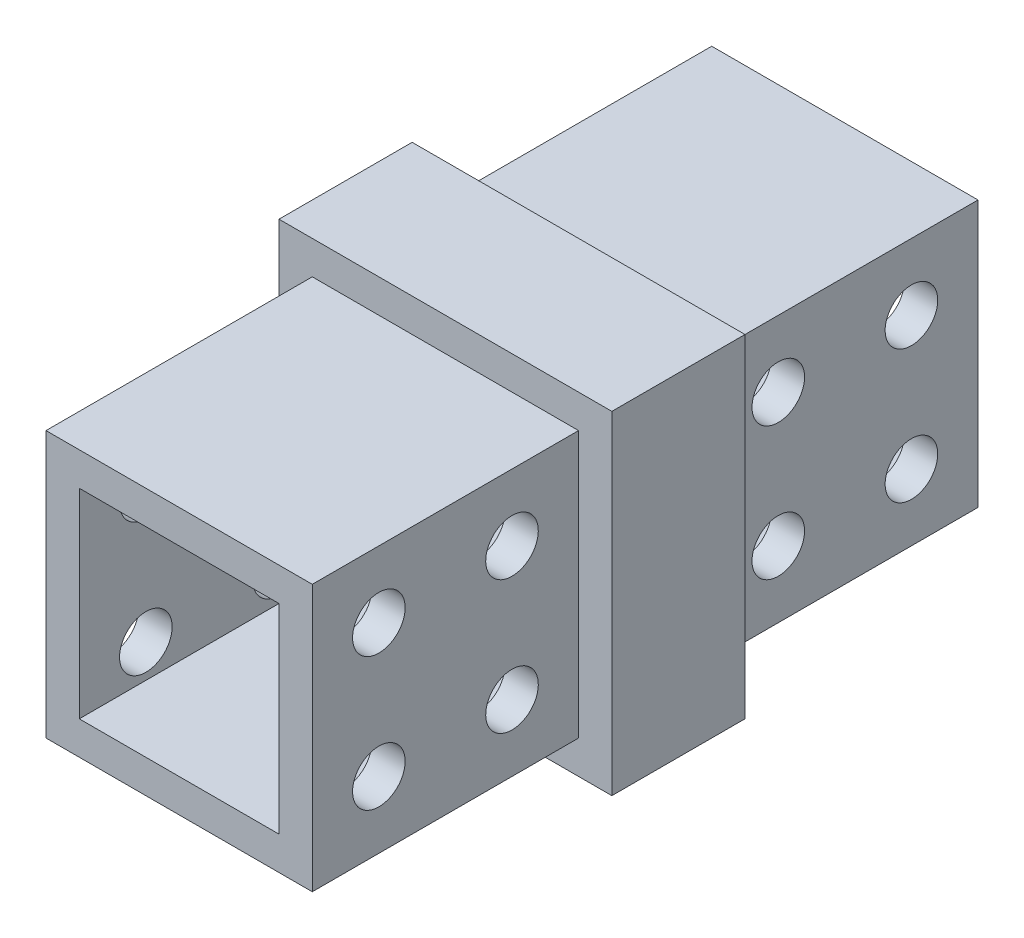
ISO-10303-21;
HEADER;
FILE_DESCRIPTION(('STEP AP214'),'2;1');
FILE_NAME('part.step','',(''),(''),'','','');
FILE_SCHEMA(('AUTOMOTIVE_DESIGN { 1 0 10303 214 1 1 1 1 }'));
ENDSEC;
DATA;
#1=APPLICATION_CONTEXT('core data for automotive mechanical design processes');
#2=APPLICATION_PROTOCOL_DEFINITION('international standard','automotive_design',2000,#1);
#3=PRODUCT_CONTEXT('',#1,'mechanical');
#4=PRODUCT('Part','Part','',(#3));
#5=PRODUCT_RELATED_PRODUCT_CATEGORY('part','',(#4));
#6=PRODUCT_DEFINITION_FORMATION('','',#4);
#7=PRODUCT_DEFINITION_CONTEXT('part definition',#1,'design');
#8=PRODUCT_DEFINITION('design','',#6,#7);
#9=PRODUCT_DEFINITION_SHAPE('','',#8);
#10=(LENGTH_UNIT() NAMED_UNIT(*) SI_UNIT(.MILLI.,.METRE.));
#11=(NAMED_UNIT(*) PLANE_ANGLE_UNIT() SI_UNIT($,.RADIAN.));
#12=(NAMED_UNIT(*) SI_UNIT($,.STERADIAN.) SOLID_ANGLE_UNIT());
#13=UNCERTAINTY_MEASURE_WITH_UNIT(LENGTH_MEASURE(1.E-05),#10,'distance_accuracy_value','');
#14=(GEOMETRIC_REPRESENTATION_CONTEXT(3) GLOBAL_UNCERTAINTY_ASSIGNED_CONTEXT((#13)) GLOBAL_UNIT_ASSIGNED_CONTEXT((#10,
#11,#12)) REPRESENTATION_CONTEXT('',''));
#15=CARTESIAN_POINT('',(0.,0.,0.));
#16=DIRECTION('',(0.,0.,1.));
#17=DIRECTION('',(1.,0.,0.));
#18=AXIS2_PLACEMENT_3D('',#15,#16,#17);
#19=CARTESIAN_POINT('',(-25.4,-6.35000000000001,57.15));
#20=DIRECTION('',(1.,0.,0.));
#21=DIRECTION('',(0.,1.,0.));
#22=AXIS2_PLACEMENT_3D('',#19,#20,#21);
#23=CYLINDRICAL_SURFACE('',#22,2.50825000000001);
#24=CARTESIAN_POINT('',(-22.225,-6.35000000000001,57.15));
#25=DIRECTION('',(-1.,0.,0.));
#26=DIRECTION('',(0.,-1.,0.));
#27=AXIS2_PLACEMENT_3D('',#24,#25,#26);
#28=CIRCLE('',#27,2.50825000000001);
#29=CARTESIAN_POINT('',(-22.225,-8.85825000000001,57.15));
#30=VERTEX_POINT('',#29);
#31=EDGE_CURVE('E205',#30,#30,#28,.F.);
#32=ORIENTED_EDGE('',*,*,#31,.T.);
#33=EDGE_LOOP('',(#32));
#34=FACE_BOUND('',#33,.T.);
#35=CARTESIAN_POINT('',(-25.4,-6.35000000000001,57.15));
#36=DIRECTION('',(1.,0.,0.));
#37=DIRECTION('',(0.,1.,0.));
#38=AXIS2_PLACEMENT_3D('',#35,#36,#37);
#39=CIRCLE('',#38,2.50825000000001);
#40=CARTESIAN_POINT('',(-25.4,-3.84175,57.15));
#41=VERTEX_POINT('',#40);
#42=EDGE_CURVE('E227',#41,#41,#39,.T.);
#43=ORIENTED_EDGE('',*,*,#42,.F.);
#44=EDGE_LOOP('',(#43));
#45=FACE_BOUND('',#44,.T.);
#46=ADVANCED_FACE('F33',(#34,#45),#23,.F.);
#47=CARTESIAN_POINT('',(-25.4,-19.05,44.45));
#48=DIRECTION('',(1.,0.,0.));
#49=DIRECTION('',(0.,1.,0.));
#50=AXIS2_PLACEMENT_3D('',#47,#48,#49);
#51=CYLINDRICAL_SURFACE('',#50,2.50825000000001);
#52=CARTESIAN_POINT('',(-22.225,-19.05,44.45));
#53=DIRECTION('',(-1.,0.,0.));
#54=DIRECTION('',(0.,-1.,0.));
#55=AXIS2_PLACEMENT_3D('',#52,#53,#54);
#56=CIRCLE('',#55,2.50825000000001);
#57=CARTESIAN_POINT('',(-22.225,-21.55825,44.45));
#58=VERTEX_POINT('',#57);
#59=EDGE_CURVE('E202',#58,#58,#56,.F.);
#60=ORIENTED_EDGE('',*,*,#59,.T.);
#61=EDGE_LOOP('',(#60));
#62=FACE_BOUND('',#61,.T.);
#63=CARTESIAN_POINT('',(-25.4,-19.05,44.45));
#64=DIRECTION('',(1.,0.,0.));
#65=DIRECTION('',(0.,1.,0.));
#66=AXIS2_PLACEMENT_3D('',#63,#64,#65);
#67=CIRCLE('',#66,2.50825000000001);
#68=CARTESIAN_POINT('',(-25.4,-16.54175,44.45));
#69=VERTEX_POINT('',#68);
#70=EDGE_CURVE('E209',#69,#69,#67,.T.);
#71=ORIENTED_EDGE('',*,*,#70,.F.);
#72=EDGE_LOOP('',(#71));
#73=FACE_BOUND('',#72,.T.);
#74=ADVANCED_FACE('F405',(#62,#73),#51,.F.);
#75=CARTESIAN_POINT('',(-25.4,-19.05,57.15));
#76=DIRECTION('',(1.,0.,0.));
#77=DIRECTION('',(0.,1.,0.));
#78=AXIS2_PLACEMENT_3D('',#75,#76,#77);
#79=CYLINDRICAL_SURFACE('',#78,2.50825);
#80=CARTESIAN_POINT('',(-22.225,-19.05,57.15));
#81=DIRECTION('',(-1.,0.,0.));
#82=DIRECTION('',(0.,-1.,0.));
#83=AXIS2_PLACEMENT_3D('',#80,#81,#82);
#84=CIRCLE('',#83,2.50825);
#85=CARTESIAN_POINT('',(-22.225,-21.55825,57.15));
#86=VERTEX_POINT('',#85);
#87=EDGE_CURVE('E199',#86,#86,#84,.F.);
#88=ORIENTED_EDGE('',*,*,#87,.T.);
#89=EDGE_LOOP('',(#88));
#90=FACE_BOUND('',#89,.T.);
#91=CARTESIAN_POINT('',(-25.4,-19.05,57.15));
#92=DIRECTION('',(1.,0.,0.));
#93=DIRECTION('',(0.,1.,0.));
#94=AXIS2_PLACEMENT_3D('',#91,#92,#93);
#95=CIRCLE('',#94,2.50825);
#96=CARTESIAN_POINT('',(-25.4,-16.54175,57.15));
#97=VERTEX_POINT('',#96);
#98=EDGE_CURVE('E222',#97,#97,#95,.T.);
#99=ORIENTED_EDGE('',*,*,#98,.F.);
#100=EDGE_LOOP('',(#99));
#101=FACE_BOUND('',#100,.T.);
#102=ADVANCED_FACE('F413',(#90,#101),#79,.F.);
#103=CARTESIAN_POINT('',(-25.4,-6.35000000000001,44.45));
#104=DIRECTION('',(1.,0.,0.));
#105=DIRECTION('',(0.,1.,0.));
#106=AXIS2_PLACEMENT_3D('',#103,#104,#105);
#107=CYLINDRICAL_SURFACE('',#106,2.50825000000001);
#108=CARTESIAN_POINT('',(-22.225,-6.35000000000001,44.45));
#109=DIRECTION('',(-1.,0.,0.));
#110=DIRECTION('',(0.,-1.,0.));
#111=AXIS2_PLACEMENT_3D('',#108,#109,#110);
#112=CIRCLE('',#111,2.50825000000001);
#113=CARTESIAN_POINT('',(-22.225,-8.85825000000001,44.45));
#114=VERTEX_POINT('',#113);
#115=EDGE_CURVE('E198',#114,#114,#112,.F.);
#116=ORIENTED_EDGE('',*,*,#115,.T.);
#117=EDGE_LOOP('',(#116));
#118=FACE_BOUND('',#117,.T.);
#119=CARTESIAN_POINT('',(-25.4,-6.35000000000001,44.45));
#120=DIRECTION('',(1.,0.,0.));
#121=DIRECTION('',(0.,1.,0.));
#122=AXIS2_PLACEMENT_3D('',#119,#120,#121);
#123=CIRCLE('',#122,2.50825000000001);
#124=CARTESIAN_POINT('',(-25.4,-3.84175,44.45));
#125=VERTEX_POINT('',#124);
#126=EDGE_CURVE('E215',#125,#125,#123,.T.);
#127=ORIENTED_EDGE('',*,*,#126,.F.);
#128=EDGE_LOOP('',(#127));
#129=FACE_BOUND('',#128,.T.);
#130=ADVANCED_FACE('F402',(#118,#129),#107,.F.);
#131=CARTESIAN_POINT('',(0.,0.,25.4));
#132=DIRECTION('',(-1.,0.,0.));
#133=DIRECTION('',(0.,-1.,0.));
#134=AXIS2_PLACEMENT_3D('',#131,#132,#133);
#135=PLANE('',#134);
#136=CARTESIAN_POINT('',(0.,-6.35,19.05));
#137=DIRECTION('',(-1.,0.,0.));
#138=DIRECTION('',(0.,1.,0.));
#139=AXIS2_PLACEMENT_3D('',#136,#137,#138);
#140=CIRCLE('',#139,2.50825000000001);
#141=CARTESIAN_POINT('',(0.,-3.84175,19.05));
#142=VERTEX_POINT('',#141);
#143=EDGE_CURVE('E362',#142,#142,#140,.T.);
#144=ORIENTED_EDGE('',*,*,#143,.T.);
#145=EDGE_LOOP('',(#144));
#146=FACE_BOUND('',#145,.T.);
#147=CARTESIAN_POINT('',(0.,-19.05,6.35));
#148=DIRECTION('',(-1.,0.,0.));
#149=DIRECTION('',(0.,1.,0.));
#150=AXIS2_PLACEMENT_3D('',#147,#148,#149);
#151=CIRCLE('',#150,2.50825);
#152=CARTESIAN_POINT('',(0.,-16.54175,6.35));
#153=VERTEX_POINT('',#152);
#154=EDGE_CURVE('E355',#153,#153,#151,.T.);
#155=ORIENTED_EDGE('',*,*,#154,.T.);
#156=EDGE_LOOP('',(#155));
#157=FACE_BOUND('',#156,.T.);
#158=CARTESIAN_POINT('',(0.,-19.05,19.05));
#159=DIRECTION('',(-1.,0.,0.));
#160=DIRECTION('',(0.,1.,0.));
#161=AXIS2_PLACEMENT_3D('',#158,#159,#160);
#162=CIRCLE('',#161,2.50825000000001);
#163=CARTESIAN_POINT('',(0.,-16.54175,19.05));
#164=VERTEX_POINT('',#163);
#165=EDGE_CURVE('E367',#164,#164,#162,.T.);
#166=ORIENTED_EDGE('',*,*,#165,.T.);
#167=EDGE_LOOP('',(#166));
#168=FACE_BOUND('',#167,.T.);
#169=CARTESIAN_POINT('',(0.,-6.35,6.35));
#170=DIRECTION('',(-1.,0.,0.));
#171=DIRECTION('',(0.,1.,0.));
#172=AXIS2_PLACEMENT_3D('',#169,#170,#171);
#173=CIRCLE('',#172,2.50825000000001);
#174=CARTESIAN_POINT('',(0.,-3.84175,6.35));
#175=VERTEX_POINT('',#174);
#176=EDGE_CURVE('E349',#175,#175,#173,.T.);
#177=ORIENTED_EDGE('',*,*,#176,.T.);
#178=EDGE_LOOP('',(#177));
#179=FACE_BOUND('',#178,.T.);
#180=DIRECTION('',(0.,1.,0.));
#181=VECTOR('',#180,1.);
#182=CARTESIAN_POINT('',(0.,0.,0.));
#183=LINE('',#182,#181);
#184=CARTESIAN_POINT('',(0.,-25.4,0.));
#185=VERTEX_POINT('',#184);
#186=CARTESIAN_POINT('',(0.,0.,0.));
#187=VERTEX_POINT('',#186);
#188=EDGE_CURVE('E295',#185,#187,#183,.T.);
#189=ORIENTED_EDGE('',*,*,#188,.T.);
#190=DIRECTION('',(0.,0.,-1.));
#191=VECTOR('',#190,1.);
#192=CARTESIAN_POINT('',(0.,0.,25.4));
#193=LINE('',#192,#191);
#194=CARTESIAN_POINT('',(0.,0.,25.4));
#195=VERTEX_POINT('',#194);
#196=EDGE_CURVE('E11',#195,#187,#193,.T.);
#197=ORIENTED_EDGE('',*,*,#196,.F.);
#198=DIRECTION('',(0.,1.,0.));
#199=VECTOR('',#198,1.);
#200=CARTESIAN_POINT('',(0.,0.,25.4));
#201=LINE('',#200,#199);
#202=CARTESIAN_POINT('',(0.,-25.4,25.4));
#203=VERTEX_POINT('',#202);
#204=EDGE_CURVE('E296',#203,#195,#201,.T.);
#205=ORIENTED_EDGE('',*,*,#204,.F.);
#206=DIRECTION('',(0.,0.,-1.));
#207=VECTOR('',#206,1.);
#208=CARTESIAN_POINT('',(0.,-25.4,25.4));
#209=LINE('',#208,#207);
#210=EDGE_CURVE('E309',#203,#185,#209,.T.);
#211=ORIENTED_EDGE('',*,*,#210,.T.);
#212=EDGE_LOOP('',(#189,#197,#205,#211));
#213=FACE_BOUND('',#212,.T.);
#214=ADVANCED_FACE('F35',(#146,#157,#168,#179,#213),#135,.F.);
#215=CARTESIAN_POINT('',(0.,0.,25.4));
#216=DIRECTION('',(0.,-1.,0.));
#217=DIRECTION('',(0.,0.,-1.));
#218=AXIS2_PLACEMENT_3D('',#215,#216,#217);
#219=PLANE('',#218);
#220=DIRECTION('',(-1.,0.,0.));
#221=VECTOR('',#220,1.);
#222=CARTESIAN_POINT('',(0.,0.,0.));
#223=LINE('',#222,#221);
#224=CARTESIAN_POINT('',(-25.4,0.,0.));
#225=VERTEX_POINT('',#224);
#226=EDGE_CURVE('E312',#187,#225,#223,.T.);
#227=ORIENTED_EDGE('',*,*,#226,.T.);
#228=DIRECTION('',(0.,0.,-1.));
#229=VECTOR('',#228,1.);
#230=CARTESIAN_POINT('',(-25.4,0.,25.4));
#231=LINE('',#230,#229);
#232=CARTESIAN_POINT('',(-25.4,0.,25.4));
#233=VERTEX_POINT('',#232);
#234=EDGE_CURVE('E42',#233,#225,#231,.T.);
#235=ORIENTED_EDGE('',*,*,#234,.F.);
#236=DIRECTION('',(-1.,0.,0.));
#237=VECTOR('',#236,1.);
#238=CARTESIAN_POINT('',(0.,0.,25.4));
#239=LINE('',#238,#237);
#240=EDGE_CURVE('E299',#195,#233,#239,.T.);
#241=ORIENTED_EDGE('',*,*,#240,.F.);
#242=ORIENTED_EDGE('',*,*,#196,.T.);
#243=EDGE_LOOP('',(#227,#235,#241,#242));
#244=FACE_BOUND('',#243,.T.);
#245=ADVANCED_FACE('F379',(#244),#219,.F.);
#246=CARTESIAN_POINT('',(-25.4,0.,25.4));
#247=DIRECTION('',(1.,0.,0.));
#248=DIRECTION('',(0.,1.,0.));
#249=AXIS2_PLACEMENT_3D('',#246,#247,#248);
#250=PLANE('',#249);
#251=CARTESIAN_POINT('',(-25.4,-6.35000000000001,19.05));
#252=DIRECTION('',(-1.,0.,0.));
#253=DIRECTION('',(0.,1.,0.));
#254=AXIS2_PLACEMENT_3D('',#251,#252,#253);
#255=CIRCLE('',#254,2.50825000000001);
#256=CARTESIAN_POINT('',(-25.4,-3.84175,19.05));
#257=VERTEX_POINT('',#256);
#258=EDGE_CURVE('E352',#257,#257,#255,.T.);
#259=ORIENTED_EDGE('',*,*,#258,.F.);
#260=EDGE_LOOP('',(#259));
#261=FACE_BOUND('',#260,.T.);
#262=CARTESIAN_POINT('',(-25.4,-19.05,6.35));
#263=DIRECTION('',(-1.,0.,0.));
#264=DIRECTION('',(0.,1.,0.));
#265=AXIS2_PLACEMENT_3D('',#262,#263,#264);
#266=CIRCLE('',#265,2.50825);
#267=CARTESIAN_POINT('',(-25.4,-16.54175,6.35));
#268=VERTEX_POINT('',#267);
#269=EDGE_CURVE('E358',#268,#268,#266,.T.);
#270=ORIENTED_EDGE('',*,*,#269,.F.);
#271=EDGE_LOOP('',(#270));
#272=FACE_BOUND('',#271,.T.);
#273=CARTESIAN_POINT('',(-25.4,-19.05,19.05));
#274=DIRECTION('',(-1.,0.,0.));
#275=DIRECTION('',(0.,1.,0.));
#276=AXIS2_PLACEMENT_3D('',#273,#274,#275);
#277=CIRCLE('',#276,2.50825000000001);
#278=CARTESIAN_POINT('',(-25.4,-16.54175,19.05));
#279=VERTEX_POINT('',#278);
#280=EDGE_CURVE('E359',#279,#279,#277,.T.);
#281=ORIENTED_EDGE('',*,*,#280,.F.);
#282=EDGE_LOOP('',(#281));
#283=FACE_BOUND('',#282,.T.);
#284=CARTESIAN_POINT('',(-25.4,-6.35000000000001,6.35));
#285=DIRECTION('',(-1.,0.,0.));
#286=DIRECTION('',(0.,1.,0.));
#287=AXIS2_PLACEMENT_3D('',#284,#285,#286);
#288=CIRCLE('',#287,2.50825000000001);
#289=CARTESIAN_POINT('',(-25.4,-3.84175,6.35));
#290=VERTEX_POINT('',#289);
#291=EDGE_CURVE('E332',#290,#290,#288,.T.);
#292=ORIENTED_EDGE('',*,*,#291,.F.);
#293=EDGE_LOOP('',(#292));
#294=FACE_BOUND('',#293,.T.);
#295=DIRECTION('',(0.,-1.,0.));
#296=VECTOR('',#295,1.);
#297=CARTESIAN_POINT('',(-25.4,0.,0.));
#298=LINE('',#297,#296);
#299=CARTESIAN_POINT('',(-25.4,-25.4,0.));
#300=VERTEX_POINT('',#299);
#301=EDGE_CURVE('E314',#225,#300,#298,.T.);
#302=ORIENTED_EDGE('',*,*,#301,.T.);
#303=DIRECTION('',(0.,0.,-1.));
#304=VECTOR('',#303,1.);
#305=CARTESIAN_POINT('',(-25.4,-25.4,25.4));
#306=LINE('',#305,#304);
#307=CARTESIAN_POINT('',(-25.4,-25.4,25.4));
#308=VERTEX_POINT('',#307);
#309=EDGE_CURVE('E319',#308,#300,#306,.T.);
#310=ORIENTED_EDGE('',*,*,#309,.F.);
#311=DIRECTION('',(0.,-1.,0.));
#312=VECTOR('',#311,1.);
#313=CARTESIAN_POINT('',(-25.4,0.,25.4));
#314=LINE('',#313,#312);
#315=EDGE_CURVE('E303',#233,#308,#314,.T.);
#316=ORIENTED_EDGE('',*,*,#315,.F.);
#317=ORIENTED_EDGE('',*,*,#234,.T.);
#318=EDGE_LOOP('',(#302,#310,#316,#317));
#319=FACE_BOUND('',#318,.T.);
#320=ADVANCED_FACE('F375',(#261,#272,#283,#294,#319),#250,.F.);
#321=CARTESIAN_POINT('',(0.,-25.4,25.4));
#322=DIRECTION('',(0.,1.,0.));
#323=DIRECTION('',(-1.,0.,0.));
#324=AXIS2_PLACEMENT_3D('',#321,#322,#323);
#325=PLANE('',#324);
#326=DIRECTION('',(1.,0.,0.));
#327=VECTOR('',#326,1.);
#328=CARTESIAN_POINT('',(0.,-25.4,0.));
#329=LINE('',#328,#327);
#330=EDGE_CURVE('E300',#300,#185,#329,.T.);
#331=ORIENTED_EDGE('',*,*,#330,.T.);
#332=ORIENTED_EDGE('',*,*,#210,.F.);
#333=DIRECTION('',(1.,0.,0.));
#334=VECTOR('',#333,1.);
#335=CARTESIAN_POINT('',(0.,-25.4,25.4));
#336=LINE('',#335,#334);
#337=EDGE_CURVE('E306',#308,#203,#336,.T.);
#338=ORIENTED_EDGE('',*,*,#337,.F.);
#339=ORIENTED_EDGE('',*,*,#309,.T.);
#340=EDGE_LOOP('',(#331,#332,#338,#339));
#341=FACE_BOUND('',#340,.T.);
#342=ADVANCED_FACE('F378',(#341),#325,.F.);
#343=CARTESIAN_POINT('',(0.,0.,0.));
#344=DIRECTION('',(0.,0.,-1.));
#345=DIRECTION('',(-1.,0.,0.));
#346=AXIS2_PLACEMENT_3D('',#343,#344,#345);
#347=PLANE('',#346);
#348=DIRECTION('',(0.,-1.,0.));
#349=VECTOR('',#348,1.);
#350=CARTESIAN_POINT('',(-22.225,-3.175,0.));
#351=LINE('',#350,#349);
#352=CARTESIAN_POINT('',(-22.225,-3.175,0.));
#353=VERTEX_POINT('',#352);
#354=CARTESIAN_POINT('',(-22.225,-22.225,0.));
#355=VERTEX_POINT('',#354);
#356=EDGE_CURVE('E151',#353,#355,#351,.T.);
#357=ORIENTED_EDGE('',*,*,#356,.T.);
#358=DIRECTION('',(1.,0.,0.));
#359=VECTOR('',#358,1.);
#360=CARTESIAN_POINT('',(-22.225,-22.225,0.));
#361=LINE('',#360,#359);
#362=CARTESIAN_POINT('',(-3.17499999999999,-22.225,0.));
#363=VERTEX_POINT('',#362);
#364=EDGE_CURVE('E160',#355,#363,#361,.T.);
#365=ORIENTED_EDGE('',*,*,#364,.T.);
#366=DIRECTION('',(0.,1.,0.));
#367=VECTOR('',#366,1.);
#368=CARTESIAN_POINT('',(-3.17499999999999,-3.175,0.));
#369=LINE('',#368,#367);
#370=CARTESIAN_POINT('',(-3.17499999999999,-3.175,0.));
#371=VERTEX_POINT('',#370);
#372=EDGE_CURVE('E50',#363,#371,#369,.T.);
#373=ORIENTED_EDGE('',*,*,#372,.T.);
#374=DIRECTION('',(-1.,0.,0.));
#375=VECTOR('',#374,1.);
#376=CARTESIAN_POINT('',(-22.225,-3.175,0.));
#377=LINE('',#376,#375);
#378=EDGE_CURVE('E157',#371,#353,#377,.T.);
#379=ORIENTED_EDGE('',*,*,#378,.T.);
#380=EDGE_LOOP('',(#357,#365,#373,#379));
#381=FACE_BOUND('',#380,.T.);
#382=ORIENTED_EDGE('',*,*,#188,.F.);
#383=ORIENTED_EDGE('',*,*,#330,.F.);
#384=ORIENTED_EDGE('',*,*,#301,.F.);
#385=ORIENTED_EDGE('',*,*,#226,.F.);
#386=EDGE_LOOP('',(#382,#383,#384,#385));
#387=FACE_BOUND('',#386,.T.);
#388=ADVANCED_FACE('F164',(#381,#387),#347,.T.);
#389=CARTESIAN_POINT('',(0.,0.,25.4));
#390=DIRECTION('',(0.,0.,1.));
#391=DIRECTION('',(1.,0.,0.));
#392=AXIS2_PLACEMENT_3D('',#389,#390,#391);
#393=PLANE('',#392);
#394=DIRECTION('',(0.,-1.,0.));
#395=VECTOR('',#394,1.);
#396=CARTESIAN_POINT('',(-28.575,3.175,25.4));
#397=LINE('',#396,#395);
#398=CARTESIAN_POINT('',(-28.575,3.175,25.4));
#399=VERTEX_POINT('',#398);
#400=CARTESIAN_POINT('',(-28.575,-28.575,25.4));
#401=VERTEX_POINT('',#400);
#402=EDGE_CURVE('E265',#399,#401,#397,.T.);
#403=ORIENTED_EDGE('',*,*,#402,.F.);
#404=DIRECTION('',(-1.,0.,0.));
#405=VECTOR('',#404,1.);
#406=CARTESIAN_POINT('',(-28.575,3.175,25.4));
#407=LINE('',#406,#405);
#408=CARTESIAN_POINT('',(3.175,3.175,25.4));
#409=VERTEX_POINT('',#408);
#410=EDGE_CURVE('E270',#409,#399,#407,.T.);
#411=ORIENTED_EDGE('',*,*,#410,.F.);
#412=DIRECTION('',(0.,1.,0.));
#413=VECTOR('',#412,1.);
#414=CARTESIAN_POINT('',(3.175,3.175,25.4));
#415=LINE('',#414,#413);
#416=CARTESIAN_POINT('',(3.17500000000001,-28.575,25.4));
#417=VERTEX_POINT('',#416);
#418=EDGE_CURVE('E281',#417,#409,#415,.T.);
#419=ORIENTED_EDGE('',*,*,#418,.F.);
#420=DIRECTION('',(1.,0.,0.));
#421=VECTOR('',#420,1.);
#422=CARTESIAN_POINT('',(-28.575,-28.575,25.4));
#423=LINE('',#422,#421);
#424=EDGE_CURVE('E279',#401,#417,#423,.T.);
#425=ORIENTED_EDGE('',*,*,#424,.F.);
#426=EDGE_LOOP('',(#403,#411,#419,#425));
#427=FACE_BOUND('',#426,.T.);
#428=ORIENTED_EDGE('',*,*,#337,.T.);
#429=ORIENTED_EDGE('',*,*,#204,.T.);
#430=ORIENTED_EDGE('',*,*,#240,.T.);
#431=ORIENTED_EDGE('',*,*,#315,.T.);
#432=EDGE_LOOP('',(#428,#429,#430,#431));
#433=FACE_BOUND('',#432,.T.);
#434=ADVANCED_FACE('F394',(#427,#433),#393,.F.);
#435=CARTESIAN_POINT('',(-28.575,3.175,38.1));
#436=DIRECTION('',(1.,0.,0.));
#437=DIRECTION('',(0.,1.,0.));
#438=AXIS2_PLACEMENT_3D('',#435,#436,#437);
#439=PLANE('',#438);
#440=ORIENTED_EDGE('',*,*,#402,.T.);
#441=DIRECTION('',(0.,0.,-1.));
#442=VECTOR('',#441,1.);
#443=CARTESIAN_POINT('',(-28.575,-28.575,38.1));
#444=LINE('',#443,#442);
#445=CARTESIAN_POINT('',(-28.575,-28.575,38.1));
#446=VERTEX_POINT('',#445);
#447=EDGE_CURVE('E292',#446,#401,#444,.T.);
#448=ORIENTED_EDGE('',*,*,#447,.F.);
#449=DIRECTION('',(0.,-1.,0.));
#450=VECTOR('',#449,1.);
#451=CARTESIAN_POINT('',(-28.575,3.175,38.1));
#452=LINE('',#451,#450);
#453=CARTESIAN_POINT('',(-28.575,3.175,38.1));
#454=VERTEX_POINT('',#453);
#455=EDGE_CURVE('E266',#454,#446,#452,.T.);
#456=ORIENTED_EDGE('',*,*,#455,.F.);
#457=DIRECTION('',(0.,0.,-1.));
#458=VECTOR('',#457,1.);
#459=CARTESIAN_POINT('',(-28.575,3.175,38.1));
#460=LINE('',#459,#458);
#461=EDGE_CURVE('E276',#454,#399,#460,.T.);
#462=ORIENTED_EDGE('',*,*,#461,.T.);
#463=EDGE_LOOP('',(#440,#448,#456,#462));
#464=FACE_BOUND('',#463,.T.);
#465=ADVANCED_FACE('F472',(#464),#439,.F.);
#466=CARTESIAN_POINT('',(-28.575,-28.575,38.1));
#467=DIRECTION('',(0.,1.,0.));
#468=DIRECTION('',(0.,0.,1.));
#469=AXIS2_PLACEMENT_3D('',#466,#467,#468);
#470=PLANE('',#469);
#471=ORIENTED_EDGE('',*,*,#424,.T.);
#472=DIRECTION('',(0.,0.,-1.));
#473=VECTOR('',#472,1.);
#474=CARTESIAN_POINT('',(3.17500000000001,-28.575,38.1));
#475=LINE('',#474,#473);
#476=CARTESIAN_POINT('',(3.17500000000001,-28.575,38.1));
#477=VERTEX_POINT('',#476);
#478=EDGE_CURVE('E289',#477,#417,#475,.T.);
#479=ORIENTED_EDGE('',*,*,#478,.F.);
#480=DIRECTION('',(1.,0.,0.));
#481=VECTOR('',#480,1.);
#482=CARTESIAN_POINT('',(-28.575,-28.575,38.1));
#483=LINE('',#482,#481);
#484=EDGE_CURVE('E269',#446,#477,#483,.T.);
#485=ORIENTED_EDGE('',*,*,#484,.F.);
#486=ORIENTED_EDGE('',*,*,#447,.T.);
#487=EDGE_LOOP('',(#471,#479,#485,#486));
#488=FACE_BOUND('',#487,.T.);
#489=ADVANCED_FACE('F480',(#488),#470,.F.);
#490=CARTESIAN_POINT('',(3.175,3.175,38.1));
#491=DIRECTION('',(-1.,0.,0.));
#492=DIRECTION('',(0.,-1.,0.));
#493=AXIS2_PLACEMENT_3D('',#490,#491,#492);
#494=PLANE('',#493);
#495=ORIENTED_EDGE('',*,*,#418,.T.);
#496=DIRECTION('',(0.,0.,-1.));
#497=VECTOR('',#496,1.);
#498=CARTESIAN_POINT('',(3.175,3.175,38.1));
#499=LINE('',#498,#497);
#500=CARTESIAN_POINT('',(3.175,3.175,38.1));
#501=VERTEX_POINT('',#500);
#502=EDGE_CURVE('E286',#501,#409,#499,.T.);
#503=ORIENTED_EDGE('',*,*,#502,.F.);
#504=DIRECTION('',(0.,1.,0.));
#505=VECTOR('',#504,1.);
#506=CARTESIAN_POINT('',(3.175,3.175,38.1));
#507=LINE('',#506,#505);
#508=EDGE_CURVE('E272',#477,#501,#507,.T.);
#509=ORIENTED_EDGE('',*,*,#508,.F.);
#510=ORIENTED_EDGE('',*,*,#478,.T.);
#511=EDGE_LOOP('',(#495,#503,#509,#510));
#512=FACE_BOUND('',#511,.T.);
#513=ADVANCED_FACE('F476',(#512),#494,.F.);
#514=CARTESIAN_POINT('',(-28.575,3.175,38.1));
#515=DIRECTION('',(0.,-1.,0.));
#516=DIRECTION('',(0.,0.,-1.));
#517=AXIS2_PLACEMENT_3D('',#514,#515,#516);
#518=PLANE('',#517);
#519=ORIENTED_EDGE('',*,*,#410,.T.);
#520=ORIENTED_EDGE('',*,*,#461,.F.);
#521=DIRECTION('',(-1.,0.,0.));
#522=VECTOR('',#521,1.);
#523=CARTESIAN_POINT('',(-28.575,3.175,38.1));
#524=LINE('',#523,#522);
#525=EDGE_CURVE('E274',#501,#454,#524,.T.);
#526=ORIENTED_EDGE('',*,*,#525,.F.);
#527=ORIENTED_EDGE('',*,*,#502,.T.);
#528=EDGE_LOOP('',(#519,#520,#526,#527));
#529=FACE_BOUND('',#528,.T.);
#530=ADVANCED_FACE('F466',(#529),#518,.F.);
#531=CARTESIAN_POINT('',(0.,0.,38.1));
#532=DIRECTION('',(0.,0.,1.));
#533=DIRECTION('',(1.,0.,0.));
#534=AXIS2_PLACEMENT_3D('',#531,#532,#533);
#535=PLANE('',#534);
#536=DIRECTION('',(0.,-1.,0.));
#537=VECTOR('',#536,1.);
#538=CARTESIAN_POINT('',(-25.4,0.,38.1));
#539=LINE('',#538,#537);
#540=CARTESIAN_POINT('',(-25.4,0.,38.1));
#541=VERTEX_POINT('',#540);
#542=CARTESIAN_POINT('',(-25.4,-25.4,38.1));
#543=VERTEX_POINT('',#542);
#544=EDGE_CURVE('E230',#541,#543,#539,.T.);
#545=ORIENTED_EDGE('',*,*,#544,.F.);
#546=DIRECTION('',(-1.,0.,0.));
#547=VECTOR('',#546,1.);
#548=CARTESIAN_POINT('',(-25.4,0.,38.1));
#549=LINE('',#548,#547);
#550=CARTESIAN_POINT('',(0.,0.,38.1));
#551=VERTEX_POINT('',#550);
#552=EDGE_CURVE('E237',#551,#541,#549,.T.);
#553=ORIENTED_EDGE('',*,*,#552,.F.);
#554=DIRECTION('',(0.,1.,0.));
#555=VECTOR('',#554,1.);
#556=CARTESIAN_POINT('',(0.,0.,38.1));
#557=LINE('',#556,#555);
#558=CARTESIAN_POINT('',(0.,-25.4,38.1));
#559=VERTEX_POINT('',#558);
#560=EDGE_CURVE('E249',#559,#551,#557,.T.);
#561=ORIENTED_EDGE('',*,*,#560,.F.);
#562=DIRECTION('',(1.,0.,0.));
#563=VECTOR('',#562,1.);
#564=CARTESIAN_POINT('',(-25.4,-25.4,38.1));
#565=LINE('',#564,#563);
#566=EDGE_CURVE('E246',#543,#559,#565,.T.);
#567=ORIENTED_EDGE('',*,*,#566,.F.);
#568=EDGE_LOOP('',(#545,#553,#561,#567));
#569=FACE_BOUND('',#568,.T.);
#570=ORIENTED_EDGE('',*,*,#455,.T.);
#571=ORIENTED_EDGE('',*,*,#484,.T.);
#572=ORIENTED_EDGE('',*,*,#508,.T.);
#573=ORIENTED_EDGE('',*,*,#525,.T.);
#574=EDGE_LOOP('',(#570,#571,#572,#573));
#575=FACE_BOUND('',#574,.T.);
#576=ADVANCED_FACE('F453',(#569,#575),#535,.T.);
#577=CARTESIAN_POINT('',(-25.4,0.,63.5));
#578=DIRECTION('',(1.,0.,0.));
#579=DIRECTION('',(0.,1.,0.));
#580=AXIS2_PLACEMENT_3D('',#577,#578,#579);
#581=PLANE('',#580);
#582=ORIENTED_EDGE('',*,*,#126,.T.);
#583=EDGE_LOOP('',(#582));
#584=FACE_BOUND('',#583,.T.);
#585=ORIENTED_EDGE('',*,*,#98,.T.);
#586=EDGE_LOOP('',(#585));
#587=FACE_BOUND('',#586,.T.);
#588=ORIENTED_EDGE('',*,*,#70,.T.);
#589=EDGE_LOOP('',(#588));
#590=FACE_BOUND('',#589,.T.);
#591=ORIENTED_EDGE('',*,*,#42,.T.);
#592=EDGE_LOOP('',(#591));
#593=FACE_BOUND('',#592,.T.);
#594=ORIENTED_EDGE('',*,*,#544,.T.);
#595=DIRECTION('',(0.,0.,-1.));
#596=VECTOR('',#595,1.);
#597=CARTESIAN_POINT('',(-25.4,-25.4,63.5));
#598=LINE('',#597,#596);
#599=CARTESIAN_POINT('',(-25.4,-25.4,63.5));
#600=VERTEX_POINT('',#599);
#601=EDGE_CURVE('E262',#600,#543,#598,.T.);
#602=ORIENTED_EDGE('',*,*,#601,.F.);
#603=DIRECTION('',(0.,-1.,0.));
#604=VECTOR('',#603,1.);
#605=CARTESIAN_POINT('',(-25.4,0.,63.5));
#606=LINE('',#605,#604);
#607=CARTESIAN_POINT('',(-25.4,0.,63.5));
#608=VERTEX_POINT('',#607);
#609=EDGE_CURVE('E233',#608,#600,#606,.T.);
#610=ORIENTED_EDGE('',*,*,#609,.F.);
#611=DIRECTION('',(0.,0.,-1.));
#612=VECTOR('',#611,1.);
#613=CARTESIAN_POINT('',(-25.4,0.,63.5));
#614=LINE('',#613,#612);
#615=EDGE_CURVE('E243',#608,#541,#614,.T.);
#616=ORIENTED_EDGE('',*,*,#615,.T.);
#617=EDGE_LOOP('',(#594,#602,#610,#616));
#618=FACE_BOUND('',#617,.T.);
#619=ADVANCED_FACE('F456',(#584,#587,#590,#593,#618),#581,.F.);
#620=CARTESIAN_POINT('',(-25.4,-25.4,63.5));
#621=DIRECTION('',(0.,1.,0.));
#622=DIRECTION('',(-1.,0.,0.));
#623=AXIS2_PLACEMENT_3D('',#620,#621,#622);
#624=PLANE('',#623);
#625=ORIENTED_EDGE('',*,*,#566,.T.);
#626=DIRECTION('',(0.,0.,-1.));
#627=VECTOR('',#626,1.);
#628=CARTESIAN_POINT('',(0.,-25.4,63.5));
#629=LINE('',#628,#627);
#630=CARTESIAN_POINT('',(0.,-25.4,63.5));
#631=VERTEX_POINT('',#630);
#632=EDGE_CURVE('E259',#631,#559,#629,.T.);
#633=ORIENTED_EDGE('',*,*,#632,.F.);
#634=DIRECTION('',(1.,0.,0.));
#635=VECTOR('',#634,1.);
#636=CARTESIAN_POINT('',(-25.4,-25.4,63.5));
#637=LINE('',#636,#635);
#638=EDGE_CURVE('E236',#600,#631,#637,.T.);
#639=ORIENTED_EDGE('',*,*,#638,.F.);
#640=ORIENTED_EDGE('',*,*,#601,.T.);
#641=EDGE_LOOP('',(#625,#633,#639,#640));
#642=FACE_BOUND('',#641,.T.);
#643=ADVANCED_FACE('F439',(#642),#624,.F.);
#644=CARTESIAN_POINT('',(0.,0.,63.5));
#645=DIRECTION('',(-1.,0.,0.));
#646=DIRECTION('',(0.,-1.,0.));
#647=AXIS2_PLACEMENT_3D('',#644,#645,#646);
#648=PLANE('',#647);
#649=CARTESIAN_POINT('',(0.,-6.35,44.45));
#650=DIRECTION('',(1.,0.,0.));
#651=DIRECTION('',(0.,1.,0.));
#652=AXIS2_PLACEMENT_3D('',#649,#650,#651);
#653=CIRCLE('',#652,2.50825000000001);
#654=CARTESIAN_POINT('',(0.,-3.84175,44.45));
#655=VERTEX_POINT('',#654);
#656=EDGE_CURVE('E219',#655,#655,#653,.T.);
#657=ORIENTED_EDGE('',*,*,#656,.F.);
#658=EDGE_LOOP('',(#657));
#659=FACE_BOUND('',#658,.T.);
#660=CARTESIAN_POINT('',(0.,-19.05,57.15));
#661=DIRECTION('',(1.,0.,0.));
#662=DIRECTION('',(0.,1.,0.));
#663=AXIS2_PLACEMENT_3D('',#660,#661,#662);
#664=CIRCLE('',#663,2.50825);
#665=CARTESIAN_POINT('',(0.,-16.54175,57.15));
#666=VERTEX_POINT('',#665);
#667=EDGE_CURVE('E212',#666,#666,#664,.T.);
#668=ORIENTED_EDGE('',*,*,#667,.F.);
#669=EDGE_LOOP('',(#668));
#670=FACE_BOUND('',#669,.T.);
#671=CARTESIAN_POINT('',(0.,-19.05,44.45));
#672=DIRECTION('',(1.,0.,0.));
#673=DIRECTION('',(0.,1.,0.));
#674=AXIS2_PLACEMENT_3D('',#671,#672,#673);
#675=CIRCLE('',#674,2.50825000000001);
#676=CARTESIAN_POINT('',(0.,-16.54175,44.45));
#677=VERTEX_POINT('',#676);
#678=EDGE_CURVE('E208',#677,#677,#675,.T.);
#679=ORIENTED_EDGE('',*,*,#678,.F.);
#680=EDGE_LOOP('',(#679));
#681=FACE_BOUND('',#680,.T.);
#682=CARTESIAN_POINT('',(0.,-6.35,57.15));
#683=DIRECTION('',(1.,0.,0.));
#684=DIRECTION('',(0.,1.,0.));
#685=AXIS2_PLACEMENT_3D('',#682,#683,#684);
#686=CIRCLE('',#685,2.50825000000001);
#687=CARTESIAN_POINT('',(0.,-3.84175,57.15));
#688=VERTEX_POINT('',#687);
#689=EDGE_CURVE('E218',#688,#688,#686,.T.);
#690=ORIENTED_EDGE('',*,*,#689,.F.);
#691=EDGE_LOOP('',(#690));
#692=FACE_BOUND('',#691,.T.);
#693=ORIENTED_EDGE('',*,*,#560,.T.);
#694=DIRECTION('',(0.,0.,-1.));
#695=VECTOR('',#694,1.);
#696=CARTESIAN_POINT('',(0.,0.,63.5));
#697=LINE('',#696,#695);
#698=CARTESIAN_POINT('',(0.,0.,63.5));
#699=VERTEX_POINT('',#698);
#700=EDGE_CURVE('E256',#699,#551,#697,.T.);
#701=ORIENTED_EDGE('',*,*,#700,.F.);
#702=DIRECTION('',(0.,1.,0.));
#703=VECTOR('',#702,1.);
#704=CARTESIAN_POINT('',(0.,0.,63.5));
#705=LINE('',#704,#703);
#706=EDGE_CURVE('E239',#631,#699,#705,.T.);
#707=ORIENTED_EDGE('',*,*,#706,.F.);
#708=ORIENTED_EDGE('',*,*,#632,.T.);
#709=EDGE_LOOP('',(#693,#701,#707,#708));
#710=FACE_BOUND('',#709,.T.);
#711=ADVANCED_FACE('F436',(#659,#670,#681,#692,#710),#648,.F.);
#712=CARTESIAN_POINT('',(-25.4,0.,63.5));
#713=DIRECTION('',(0.,-1.,0.));
#714=DIRECTION('',(0.,0.,-1.));
#715=AXIS2_PLACEMENT_3D('',#712,#713,#714);
#716=PLANE('',#715);
#717=ORIENTED_EDGE('',*,*,#552,.T.);
#718=ORIENTED_EDGE('',*,*,#615,.F.);
#719=DIRECTION('',(-1.,0.,0.));
#720=VECTOR('',#719,1.);
#721=CARTESIAN_POINT('',(-25.4,0.,63.5));
#722=LINE('',#721,#720);
#723=EDGE_CURVE('E241',#699,#608,#722,.T.);
#724=ORIENTED_EDGE('',*,*,#723,.F.);
#725=ORIENTED_EDGE('',*,*,#700,.T.);
#726=EDGE_LOOP('',(#717,#718,#724,#725));
#727=FACE_BOUND('',#726,.T.);
#728=ADVANCED_FACE('F430',(#727),#716,.F.);
#729=CARTESIAN_POINT('',(0.,0.,63.5));
#730=DIRECTION('',(0.,0.,1.));
#731=DIRECTION('',(1.,0.,0.));
#732=AXIS2_PLACEMENT_3D('',#729,#730,#731);
#733=PLANE('',#732);
#734=DIRECTION('',(0.,-1.,0.));
#735=VECTOR('',#734,1.);
#736=CARTESIAN_POINT('',(-22.225,-3.175,63.5));
#737=LINE('',#736,#735);
#738=CARTESIAN_POINT('',(-22.225,-3.175,63.5));
#739=VERTEX_POINT('',#738);
#740=CARTESIAN_POINT('',(-22.225,-22.225,63.5));
#741=VERTEX_POINT('',#740);
#742=EDGE_CURVE('E58',#739,#741,#737,.T.);
#743=ORIENTED_EDGE('',*,*,#742,.F.);
#744=DIRECTION('',(-1.,0.,0.));
#745=VECTOR('',#744,1.);
#746=CARTESIAN_POINT('',(-22.225,-3.175,63.5));
#747=LINE('',#746,#745);
#748=CARTESIAN_POINT('',(-3.17499999999999,-3.175,63.5));
#749=VERTEX_POINT('',#748);
#750=EDGE_CURVE('E167',#749,#739,#747,.T.);
#751=ORIENTED_EDGE('',*,*,#750,.F.);
#752=DIRECTION('',(0.,1.,0.));
#753=VECTOR('',#752,1.);
#754=CARTESIAN_POINT('',(-3.17499999999999,-3.175,63.5));
#755=LINE('',#754,#753);
#756=CARTESIAN_POINT('',(-3.17499999999999,-22.225,63.5));
#757=VERTEX_POINT('',#756);
#758=EDGE_CURVE('E170',#757,#749,#755,.T.);
#759=ORIENTED_EDGE('',*,*,#758,.F.);
#760=DIRECTION('',(1.,0.,0.));
#761=VECTOR('',#760,1.);
#762=CARTESIAN_POINT('',(-22.225,-22.225,63.5));
#763=LINE('',#762,#761);
#764=EDGE_CURVE('E179',#741,#757,#763,.T.);
#765=ORIENTED_EDGE('',*,*,#764,.F.);
#766=EDGE_LOOP('',(#743,#751,#759,#765));
#767=FACE_BOUND('',#766,.T.);
#768=ORIENTED_EDGE('',*,*,#609,.T.);
#769=ORIENTED_EDGE('',*,*,#638,.T.);
#770=ORIENTED_EDGE('',*,*,#706,.T.);
#771=ORIENTED_EDGE('',*,*,#723,.T.);
#772=EDGE_LOOP('',(#768,#769,#770,#771));
#773=FACE_BOUND('',#772,.T.);
#774=ADVANCED_FACE('F421',(#767,#773),#733,.T.);
#775=CARTESIAN_POINT('',(-3.17499999999999,-6.35,57.15));
#776=DIRECTION('',(1.,0.,0.));
#777=DIRECTION('',(0.,1.,0.));
#778=AXIS2_PLACEMENT_3D('',#775,#776,#777);
#779=CIRCLE('',#778,2.50825000000001);
#780=CARTESIAN_POINT('',(-3.17499999999999,-3.84175,57.15));
#781=VERTEX_POINT('',#780);
#782=EDGE_CURVE('E195',#781,#781,#779,.F.);
#783=ORIENTED_EDGE('',*,*,#782,.T.);
#784=EDGE_LOOP('',(#783));
#785=FACE_BOUND('',#784,.T.);
#786=ORIENTED_EDGE('',*,*,#689,.T.);
#787=EDGE_LOOP('',(#786));
#788=FACE_BOUND('',#787,.T.);
#789=ADVANCED_FACE('F408',(#785,#788),#23,.F.);
#790=CARTESIAN_POINT('',(-3.17499999999999,-19.05,44.45));
#791=DIRECTION('',(1.,0.,0.));
#792=DIRECTION('',(0.,1.,0.));
#793=AXIS2_PLACEMENT_3D('',#790,#791,#792);
#794=CIRCLE('',#793,2.50825000000001);
#795=CARTESIAN_POINT('',(-3.17499999999999,-16.54175,44.45));
#796=VERTEX_POINT('',#795);
#797=EDGE_CURVE('E192',#796,#796,#794,.F.);
#798=ORIENTED_EDGE('',*,*,#797,.T.);
#799=EDGE_LOOP('',(#798));
#800=FACE_BOUND('',#799,.T.);
#801=ORIENTED_EDGE('',*,*,#678,.T.);
#802=EDGE_LOOP('',(#801));
#803=FACE_BOUND('',#802,.T.);
#804=ADVANCED_FACE('F416',(#800,#803),#51,.F.);
#805=CARTESIAN_POINT('',(-3.17499999999999,-19.05,57.15));
#806=DIRECTION('',(1.,0.,0.));
#807=DIRECTION('',(0.,1.,0.));
#808=AXIS2_PLACEMENT_3D('',#805,#806,#807);
#809=CIRCLE('',#808,2.50825);
#810=CARTESIAN_POINT('',(-3.17499999999999,-16.54175,57.15));
#811=VERTEX_POINT('',#810);
#812=EDGE_CURVE('E189',#811,#811,#809,.F.);
#813=ORIENTED_EDGE('',*,*,#812,.T.);
#814=EDGE_LOOP('',(#813));
#815=FACE_BOUND('',#814,.T.);
#816=ORIENTED_EDGE('',*,*,#667,.T.);
#817=EDGE_LOOP('',(#816));
#818=FACE_BOUND('',#817,.T.);
#819=ADVANCED_FACE('F427',(#815,#818),#79,.F.);
#820=CARTESIAN_POINT('',(-3.17499999999999,-6.35,44.45));
#821=DIRECTION('',(1.,0.,0.));
#822=DIRECTION('',(0.,1.,0.));
#823=AXIS2_PLACEMENT_3D('',#820,#821,#822);
#824=CIRCLE('',#823,2.50825000000001);
#825=CARTESIAN_POINT('',(-3.17499999999999,-3.84175,44.45));
#826=VERTEX_POINT('',#825);
#827=EDGE_CURVE('E185',#826,#826,#824,.F.);
#828=ORIENTED_EDGE('',*,*,#827,.T.);
#829=EDGE_LOOP('',(#828));
#830=FACE_BOUND('',#829,.T.);
#831=ORIENTED_EDGE('',*,*,#656,.T.);
#832=EDGE_LOOP('',(#831));
#833=FACE_BOUND('',#832,.T.);
#834=ADVANCED_FACE('F567',(#830,#833),#107,.F.);
#835=CARTESIAN_POINT('',(-22.225,-3.175,0.));
#836=DIRECTION('',(-1.,0.,0.));
#837=DIRECTION('',(0.,-1.,0.));
#838=AXIS2_PLACEMENT_3D('',#835,#836,#837);
#839=PLANE('',#838);
#840=CARTESIAN_POINT('',(-22.225,-6.35000000000001,19.05));
#841=DIRECTION('',(-1.,0.,0.));
#842=DIRECTION('',(0.,-1.,0.));
#843=AXIS2_PLACEMENT_3D('',#840,#841,#842);
#844=CIRCLE('',#843,2.50825000000001);
#845=CARTESIAN_POINT('',(-22.225,-8.85825000000001,19.05));
#846=VERTEX_POINT('',#845);
#847=EDGE_CURVE('E173',#846,#846,#844,.F.);
#848=ORIENTED_EDGE('',*,*,#847,.F.);
#849=EDGE_LOOP('',(#848));
#850=FACE_BOUND('',#849,.T.);
#851=CARTESIAN_POINT('',(-22.225,-19.05,6.35));
#852=DIRECTION('',(-1.,0.,0.));
#853=DIRECTION('',(0.,-1.,0.));
#854=AXIS2_PLACEMENT_3D('',#851,#852,#853);
#855=CIRCLE('',#854,2.50825);
#856=CARTESIAN_POINT('',(-22.225,-21.55825,6.35));
#857=VERTEX_POINT('',#856);
#858=EDGE_CURVE('E338',#857,#857,#855,.F.);
#859=ORIENTED_EDGE('',*,*,#858,.F.);
#860=EDGE_LOOP('',(#859));
#861=FACE_BOUND('',#860,.T.);
#862=CARTESIAN_POINT('',(-22.225,-19.05,19.05));
#863=DIRECTION('',(-1.,0.,0.));
#864=DIRECTION('',(0.,-1.,0.));
#865=AXIS2_PLACEMENT_3D('',#862,#863,#864);
#866=CIRCLE('',#865,2.50825000000001);
#867=CARTESIAN_POINT('',(-22.225,-21.55825,19.05));
#868=VERTEX_POINT('',#867);
#869=EDGE_CURVE('E335',#868,#868,#866,.F.);
#870=ORIENTED_EDGE('',*,*,#869,.F.);
#871=EDGE_LOOP('',(#870));
#872=FACE_BOUND('',#871,.T.);
#873=CARTESIAN_POINT('',(-22.225,-6.35000000000001,6.35));
#874=DIRECTION('',(-1.,0.,0.));
#875=DIRECTION('',(0.,-1.,0.));
#876=AXIS2_PLACEMENT_3D('',#873,#874,#875);
#877=CIRCLE('',#876,2.50825000000001);
#878=CARTESIAN_POINT('',(-22.225,-8.85825000000001,6.35));
#879=VERTEX_POINT('',#878);
#880=EDGE_CURVE('E331',#879,#879,#877,.F.);
#881=ORIENTED_EDGE('',*,*,#880,.F.);
#882=EDGE_LOOP('',(#881));
#883=FACE_BOUND('',#882,.T.);
#884=ORIENTED_EDGE('',*,*,#59,.F.);
#885=EDGE_LOOP('',(#884));
#886=FACE_BOUND('',#885,.T.);
#887=ORIENTED_EDGE('',*,*,#115,.F.);
#888=EDGE_LOOP('',(#887));
#889=FACE_BOUND('',#888,.T.);
#890=ORIENTED_EDGE('',*,*,#742,.T.);
#891=DIRECTION('',(0.,0.,1.));
#892=VECTOR('',#891,1.);
#893=CARTESIAN_POINT('',(-22.225,-22.225,0.));
#894=LINE('',#893,#892);
#895=EDGE_CURVE('E146',#355,#741,#894,.T.);
#896=ORIENTED_EDGE('',*,*,#895,.F.);
#897=ORIENTED_EDGE('',*,*,#356,.F.);
#898=DIRECTION('',(0.,0.,1.));
#899=VECTOR('',#898,1.);
#900=CARTESIAN_POINT('',(-22.225,-3.175,0.));
#901=LINE('',#900,#899);
#902=EDGE_CURVE('E183',#353,#739,#901,.T.);
#903=ORIENTED_EDGE('',*,*,#902,.T.);
#904=EDGE_LOOP('',(#890,#896,#897,#903));
#905=FACE_BOUND('',#904,.T.);
#906=ORIENTED_EDGE('',*,*,#87,.F.);
#907=EDGE_LOOP('',(#906));
#908=FACE_BOUND('',#907,.T.);
#909=ORIENTED_EDGE('',*,*,#31,.F.);
#910=EDGE_LOOP('',(#909));
#911=FACE_BOUND('',#910,.T.);
#912=ADVANCED_FACE('F148',(#850,#861,#872,#883,#886,#889,#905,#908,#911),#839,.F.);
#913=CARTESIAN_POINT('',(-3.17499999999999,-3.175,0.));
#914=DIRECTION('',(1.,0.,0.));
#915=DIRECTION('',(0.,1.,0.));
#916=AXIS2_PLACEMENT_3D('',#913,#914,#915);
#917=PLANE('',#916);
#918=CARTESIAN_POINT('',(-3.17499999999999,-6.35,19.05));
#919=DIRECTION('',(1.,0.,0.));
#920=DIRECTION('',(0.,1.,0.));
#921=AXIS2_PLACEMENT_3D('',#918,#919,#920);
#922=CIRCLE('',#921,2.50825000000001);
#923=CARTESIAN_POINT('',(-3.17499999999999,-3.84175,19.05));
#924=VERTEX_POINT('',#923);
#925=EDGE_CURVE('E37',#924,#924,#922,.F.);
#926=ORIENTED_EDGE('',*,*,#925,.F.);
#927=EDGE_LOOP('',(#926));
#928=FACE_BOUND('',#927,.T.);
#929=CARTESIAN_POINT('',(-3.17499999999999,-19.05,6.35));
#930=DIRECTION('',(1.,0.,0.));
#931=DIRECTION('',(0.,1.,0.));
#932=AXIS2_PLACEMENT_3D('',#929,#930,#931);
#933=CIRCLE('',#932,2.50825);
#934=CARTESIAN_POINT('',(-3.17499999999999,-16.54175,6.35));
#935=VERTEX_POINT('',#934);
#936=EDGE_CURVE('E336',#935,#935,#933,.F.);
#937=ORIENTED_EDGE('',*,*,#936,.F.);
#938=EDGE_LOOP('',(#937));
#939=FACE_BOUND('',#938,.T.);
#940=CARTESIAN_POINT('',(-3.17499999999999,-19.05,19.05));
#941=DIRECTION('',(1.,0.,0.));
#942=DIRECTION('',(0.,1.,0.));
#943=AXIS2_PLACEMENT_3D('',#940,#941,#942);
#944=CIRCLE('',#943,2.50825000000001);
#945=CARTESIAN_POINT('',(-3.17499999999999,-16.54175,19.05));
#946=VERTEX_POINT('',#945);
#947=EDGE_CURVE('E333',#946,#946,#944,.F.);
#948=ORIENTED_EDGE('',*,*,#947,.F.);
#949=EDGE_LOOP('',(#948));
#950=FACE_BOUND('',#949,.T.);
#951=CARTESIAN_POINT('',(-3.17499999999999,-6.35,6.35));
#952=DIRECTION('',(1.,0.,0.));
#953=DIRECTION('',(0.,1.,0.));
#954=AXIS2_PLACEMENT_3D('',#951,#952,#953);
#955=CIRCLE('',#954,2.50825000000001);
#956=CARTESIAN_POINT('',(-3.17499999999999,-3.84175,6.35));
#957=VERTEX_POINT('',#956);
#958=EDGE_CURVE('E328',#957,#957,#955,.F.);
#959=ORIENTED_EDGE('',*,*,#958,.F.);
#960=EDGE_LOOP('',(#959));
#961=FACE_BOUND('',#960,.T.);
#962=ORIENTED_EDGE('',*,*,#797,.F.);
#963=EDGE_LOOP('',(#962));
#964=FACE_BOUND('',#963,.T.);
#965=ORIENTED_EDGE('',*,*,#827,.F.);
#966=EDGE_LOOP('',(#965));
#967=FACE_BOUND('',#966,.T.);
#968=ORIENTED_EDGE('',*,*,#758,.T.);
#969=DIRECTION('',(0.,0.,1.));
#970=VECTOR('',#969,1.);
#971=CARTESIAN_POINT('',(-3.17499999999999,-3.175,0.));
#972=LINE('',#971,#970);
#973=EDGE_CURVE('E186',#371,#749,#972,.T.);
#974=ORIENTED_EDGE('',*,*,#973,.F.);
#975=ORIENTED_EDGE('',*,*,#372,.F.);
#976=DIRECTION('',(0.,0.,1.));
#977=VECTOR('',#976,1.);
#978=CARTESIAN_POINT('',(-3.17499999999999,-22.225,0.));
#979=LINE('',#978,#977);
#980=EDGE_CURVE('E156',#363,#757,#979,.T.);
#981=ORIENTED_EDGE('',*,*,#980,.T.);
#982=EDGE_LOOP('',(#968,#974,#975,#981));
#983=FACE_BOUND('',#982,.T.);
#984=ORIENTED_EDGE('',*,*,#812,.F.);
#985=EDGE_LOOP('',(#984));
#986=FACE_BOUND('',#985,.T.);
#987=ORIENTED_EDGE('',*,*,#782,.F.);
#988=EDGE_LOOP('',(#987));
#989=FACE_BOUND('',#988,.T.);
#990=ADVANCED_FACE('F588',(#928,#939,#950,#961,#964,#967,#983,#986,#989),#917,.F.);
#991=CARTESIAN_POINT('',(-22.225,-3.175,0.));
#992=DIRECTION('',(0.,1.,0.));
#993=DIRECTION('',(0.,0.,1.));
#994=AXIS2_PLACEMENT_3D('',#991,#992,#993);
#995=PLANE('',#994);
#996=ORIENTED_EDGE('',*,*,#750,.T.);
#997=ORIENTED_EDGE('',*,*,#902,.F.);
#998=ORIENTED_EDGE('',*,*,#378,.F.);
#999=ORIENTED_EDGE('',*,*,#973,.T.);
#1000=EDGE_LOOP('',(#996,#997,#998,#999));
#1001=FACE_BOUND('',#1000,.T.);
#1002=ADVANCED_FACE('F583',(#1001),#995,.F.);
#1003=CARTESIAN_POINT('',(-22.225,-22.225,0.));
#1004=DIRECTION('',(0.,-1.,0.));
#1005=DIRECTION('',(0.,0.,-1.));
#1006=AXIS2_PLACEMENT_3D('',#1003,#1004,#1005);
#1007=PLANE('',#1006);
#1008=ORIENTED_EDGE('',*,*,#764,.T.);
#1009=ORIENTED_EDGE('',*,*,#980,.F.);
#1010=ORIENTED_EDGE('',*,*,#364,.F.);
#1011=ORIENTED_EDGE('',*,*,#895,.T.);
#1012=EDGE_LOOP('',(#1008,#1009,#1010,#1011));
#1013=FACE_BOUND('',#1012,.T.);
#1014=ADVANCED_FACE('F161',(#1013),#1007,.F.);
#1015=CARTESIAN_POINT('',(-25.4,-6.35000000000001,6.35));
#1016=DIRECTION('',(1.,0.,0.));
#1017=DIRECTION('',(0.,1.,0.));
#1018=AXIS2_PLACEMENT_3D('',#1015,#1016,#1017);
#1019=CYLINDRICAL_SURFACE('',#1018,2.50825000000001);
#1020=ORIENTED_EDGE('',*,*,#176,.F.);
#1021=EDGE_LOOP('',(#1020));
#1022=FACE_BOUND('',#1021,.T.);
#1023=ORIENTED_EDGE('',*,*,#958,.T.);
#1024=EDGE_LOOP('',(#1023));
#1025=FACE_BOUND('',#1024,.T.);
#1026=ADVANCED_FACE('F599',(#1022,#1025),#1019,.F.);
#1027=CARTESIAN_POINT('',(-25.4,-19.05,19.05));
#1028=DIRECTION('',(1.,0.,0.));
#1029=DIRECTION('',(0.,1.,0.));
#1030=AXIS2_PLACEMENT_3D('',#1027,#1028,#1029);
#1031=CYLINDRICAL_SURFACE('',#1030,2.50825000000001);
#1032=ORIENTED_EDGE('',*,*,#165,.F.);
#1033=EDGE_LOOP('',(#1032));
#1034=FACE_BOUND('',#1033,.T.);
#1035=ORIENTED_EDGE('',*,*,#947,.T.);
#1036=EDGE_LOOP('',(#1035));
#1037=FACE_BOUND('',#1036,.T.);
#1038=ADVANCED_FACE('F624',(#1034,#1037),#1031,.F.);
#1039=CARTESIAN_POINT('',(-25.4,-19.05,6.35));
#1040=DIRECTION('',(1.,0.,0.));
#1041=DIRECTION('',(0.,1.,0.));
#1042=AXIS2_PLACEMENT_3D('',#1039,#1040,#1041);
#1043=CYLINDRICAL_SURFACE('',#1042,2.50825);
#1044=ORIENTED_EDGE('',*,*,#154,.F.);
#1045=EDGE_LOOP('',(#1044));
#1046=FACE_BOUND('',#1045,.T.);
#1047=ORIENTED_EDGE('',*,*,#936,.T.);
#1048=EDGE_LOOP('',(#1047));
#1049=FACE_BOUND('',#1048,.T.);
#1050=ADVANCED_FACE('F635',(#1046,#1049),#1043,.F.);
#1051=CARTESIAN_POINT('',(-25.4,-6.35000000000001,19.05));
#1052=DIRECTION('',(1.,0.,0.));
#1053=DIRECTION('',(0.,1.,0.));
#1054=AXIS2_PLACEMENT_3D('',#1051,#1052,#1053);
#1055=CYLINDRICAL_SURFACE('',#1054,2.50825000000001);
#1056=ORIENTED_EDGE('',*,*,#143,.F.);
#1057=EDGE_LOOP('',(#1056));
#1058=FACE_BOUND('',#1057,.T.);
#1059=ORIENTED_EDGE('',*,*,#925,.T.);
#1060=EDGE_LOOP('',(#1059));
#1061=FACE_BOUND('',#1060,.T.);
#1062=ADVANCED_FACE('F645',(#1058,#1061),#1055,.F.);
#1063=ORIENTED_EDGE('',*,*,#291,.T.);
#1064=EDGE_LOOP('',(#1063));
#1065=FACE_BOUND('',#1064,.T.);
#1066=ORIENTED_EDGE('',*,*,#880,.T.);
#1067=EDGE_LOOP('',(#1066));
#1068=FACE_BOUND('',#1067,.T.);
#1069=ADVANCED_FACE('F627',(#1065,#1068),#1019,.F.);
#1070=ORIENTED_EDGE('',*,*,#280,.T.);
#1071=EDGE_LOOP('',(#1070));
#1072=FACE_BOUND('',#1071,.T.);
#1073=ORIENTED_EDGE('',*,*,#869,.T.);
#1074=EDGE_LOOP('',(#1073));
#1075=FACE_BOUND('',#1074,.T.);
#1076=ADVANCED_FACE('F373',(#1072,#1075),#1031,.F.);
#1077=ORIENTED_EDGE('',*,*,#269,.T.);
#1078=EDGE_LOOP('',(#1077));
#1079=FACE_BOUND('',#1078,.T.);
#1080=ORIENTED_EDGE('',*,*,#858,.T.);
#1081=EDGE_LOOP('',(#1080));
#1082=FACE_BOUND('',#1081,.T.);
#1083=ADVANCED_FACE('F648',(#1079,#1082),#1043,.F.);
#1084=ORIENTED_EDGE('',*,*,#258,.T.);
#1085=EDGE_LOOP('',(#1084));
#1086=FACE_BOUND('',#1085,.T.);
#1087=ORIENTED_EDGE('',*,*,#847,.T.);
#1088=EDGE_LOOP('',(#1087));
#1089=FACE_BOUND('',#1088,.T.);
#1090=ADVANCED_FACE('F658',(#1086,#1089),#1055,.F.);
#1091=CLOSED_SHELL('',(#46,#74,#102,#130,#214,#245,#320,#342,#388,#434,#465,#489,#513,#530,#576,
#619,#643,#711,#728,#774,#789,#804,#819,#834,#912,#990,#1002,#1014,#1026,#1038,#1050,#1062,
#1069,#1076,#1083,#1090));
#1092=MANIFOLD_SOLID_BREP('B2',#1091);
#1093=ADVANCED_BREP_SHAPE_REPRESENTATION('',(#18,#1092),#14);
#1094=SHAPE_DEFINITION_REPRESENTATION(#9,#1093);
ENDSEC;
END-ISO-10303-21;
